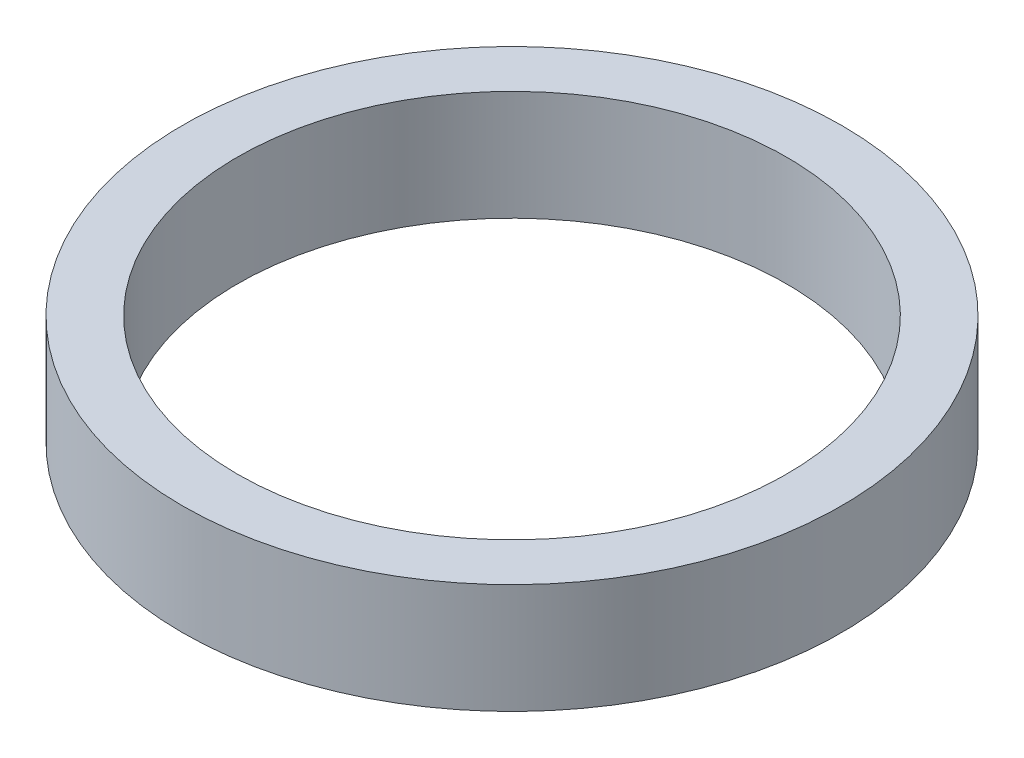
ISO-10303-21;
HEADER;
FILE_DESCRIPTION(('STEP AP214'),'2;1');
FILE_NAME('part.step','',(''),(''),'','','');
FILE_SCHEMA(('AUTOMOTIVE_DESIGN { 1 0 10303 214 1 1 1 1 }'));
ENDSEC;
DATA;
#1=APPLICATION_CONTEXT('core data for automotive mechanical design processes');
#2=APPLICATION_PROTOCOL_DEFINITION('international standard','automotive_design',2000,#1);
#3=PRODUCT_CONTEXT('',#1,'mechanical');
#4=PRODUCT('Part','Part','',(#3));
#5=PRODUCT_RELATED_PRODUCT_CATEGORY('part','',(#4));
#6=PRODUCT_DEFINITION_FORMATION('','',#4);
#7=PRODUCT_DEFINITION_CONTEXT('part definition',#1,'design');
#8=PRODUCT_DEFINITION('design','',#6,#7);
#9=PRODUCT_DEFINITION_SHAPE('','',#8);
#10=(LENGTH_UNIT() NAMED_UNIT(*) SI_UNIT(.MILLI.,.METRE.));
#11=(NAMED_UNIT(*) PLANE_ANGLE_UNIT() SI_UNIT($,.RADIAN.));
#12=(NAMED_UNIT(*) SI_UNIT($,.STERADIAN.) SOLID_ANGLE_UNIT());
#13=UNCERTAINTY_MEASURE_WITH_UNIT(LENGTH_MEASURE(1.E-05),#10,'distance_accuracy_value','');
#14=(GEOMETRIC_REPRESENTATION_CONTEXT(3) GLOBAL_UNCERTAINTY_ASSIGNED_CONTEXT((#13)) GLOBAL_UNIT_ASSIGNED_CONTEXT((#10,
#11,#12)) REPRESENTATION_CONTEXT('',''));
#15=CARTESIAN_POINT('',(0.,0.,0.));
#16=DIRECTION('',(0.,0.,1.));
#17=DIRECTION('',(1.,0.,0.));
#18=AXIS2_PLACEMENT_3D('',#15,#16,#17);
#19=CARTESIAN_POINT('',(0.,5.,0.));
#20=DIRECTION('',(0.,1.,0.));
#21=DIRECTION('',(0.,0.,1.));
#22=AXIS2_PLACEMENT_3D('',#19,#20,#21);
#23=PLANE('',#22);
#24=CARTESIAN_POINT('',(0.,5.,0.));
#25=DIRECTION('',(0.,1.,0.));
#26=DIRECTION('',(0.,0.,1.));
#27=AXIS2_PLACEMENT_3D('',#24,#25,#26);
#28=CIRCLE('',#27,15.);
#29=CARTESIAN_POINT('',(0.,5.,15.));
#30=VERTEX_POINT('',#29);
#31=EDGE_CURVE('E10',#30,#30,#28,.T.);
#32=ORIENTED_EDGE('',*,*,#31,.T.);
#33=EDGE_LOOP('',(#32));
#34=FACE_BOUND('',#33,.T.);
#35=CARTESIAN_POINT('',(0.,5.,0.));
#36=DIRECTION('',(0.,1.,0.));
#37=DIRECTION('',(0.,0.,1.));
#38=AXIS2_PLACEMENT_3D('',#35,#36,#37);
#39=CIRCLE('',#38,12.5);
#40=CARTESIAN_POINT('',(0.,5.,12.5));
#41=VERTEX_POINT('',#40);
#42=EDGE_CURVE('E41',#41,#41,#39,.T.);
#43=ORIENTED_EDGE('',*,*,#42,.F.);
#44=EDGE_LOOP('',(#43));
#45=FACE_BOUND('',#44,.T.);
#46=ADVANCED_FACE('F30',(#34,#45),#23,.T.);
#47=CARTESIAN_POINT('',(0.,0.,0.));
#48=DIRECTION('',(0.,1.,0.));
#49=DIRECTION('',(0.,0.,1.));
#50=AXIS2_PLACEMENT_3D('',#47,#48,#49);
#51=PLANE('',#50);
#52=CARTESIAN_POINT('',(0.,0.,0.));
#53=DIRECTION('',(0.,1.,0.));
#54=DIRECTION('',(0.,0.,1.));
#55=AXIS2_PLACEMENT_3D('',#52,#53,#54);
#56=CIRCLE('',#55,15.);
#57=CARTESIAN_POINT('',(0.,0.,15.));
#58=VERTEX_POINT('',#57);
#59=EDGE_CURVE('E34',#58,#58,#56,.T.);
#60=ORIENTED_EDGE('',*,*,#59,.F.);
#61=EDGE_LOOP('',(#60));
#62=FACE_BOUND('',#61,.T.);
#63=CARTESIAN_POINT('',(0.,0.,0.));
#64=DIRECTION('',(0.,1.,0.));
#65=DIRECTION('',(0.,0.,1.));
#66=AXIS2_PLACEMENT_3D('',#63,#64,#65);
#67=CIRCLE('',#66,12.5);
#68=CARTESIAN_POINT('',(0.,0.,12.5));
#69=VERTEX_POINT('',#68);
#70=EDGE_CURVE('E43',#69,#69,#67,.T.);
#71=ORIENTED_EDGE('',*,*,#70,.T.);
#72=EDGE_LOOP('',(#71));
#73=FACE_BOUND('',#72,.T.);
#74=ADVANCED_FACE('F53',(#62,#73),#51,.F.);
#75=CARTESIAN_POINT('',(0.,5.,0.));
#76=DIRECTION('',(0.,-1.,0.));
#77=DIRECTION('',(0.,0.,-1.));
#78=AXIS2_PLACEMENT_3D('',#75,#76,#77);
#79=CYLINDRICAL_SURFACE('',#78,15.);
#80=ORIENTED_EDGE('',*,*,#31,.F.);
#81=EDGE_LOOP('',(#80));
#82=FACE_BOUND('',#81,.T.);
#83=ORIENTED_EDGE('',*,*,#59,.T.);
#84=EDGE_LOOP('',(#83));
#85=FACE_BOUND('',#84,.T.);
#86=ADVANCED_FACE('F32',(#82,#85),#79,.T.);
#87=CARTESIAN_POINT('',(0.,5.,0.));
#88=DIRECTION('',(0.,-1.,0.));
#89=DIRECTION('',(0.,0.,-1.));
#90=AXIS2_PLACEMENT_3D('',#87,#88,#89);
#91=CYLINDRICAL_SURFACE('',#90,12.5);
#92=ORIENTED_EDGE('',*,*,#42,.T.);
#93=EDGE_LOOP('',(#92));
#94=FACE_BOUND('',#93,.T.);
#95=ORIENTED_EDGE('',*,*,#70,.F.);
#96=EDGE_LOOP('',(#95));
#97=FACE_BOUND('',#96,.T.);
#98=ADVANCED_FACE('F49',(#94,#97),#91,.F.);
#99=CLOSED_SHELL('',(#46,#74,#86,#98));
#100=MANIFOLD_SOLID_BREP('B2',#99);
#101=ADVANCED_BREP_SHAPE_REPRESENTATION('',(#18,#100),#14);
#102=SHAPE_DEFINITION_REPRESENTATION(#9,#101);
ENDSEC;
END-ISO-10303-21;
